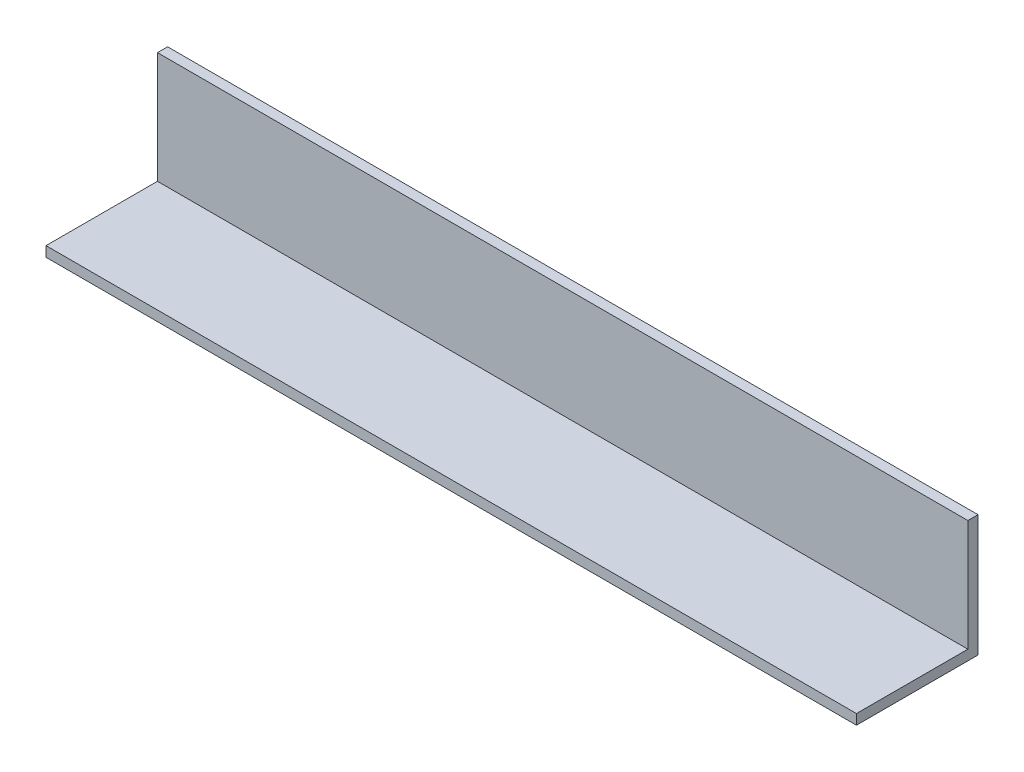
ISO-10303-21;
HEADER;
FILE_DESCRIPTION(('STEP AP214'),'2;1');
FILE_NAME('part.step','',(''),(''),'','','');
FILE_SCHEMA(('AUTOMOTIVE_DESIGN { 1 0 10303 214 1 1 1 1 }'));
ENDSEC;
DATA;
#1=APPLICATION_CONTEXT('core data for automotive mechanical design processes');
#2=APPLICATION_PROTOCOL_DEFINITION('international standard','automotive_design',2000,#1);
#3=PRODUCT_CONTEXT('',#1,'mechanical');
#4=PRODUCT('Part','Part','',(#3));
#5=PRODUCT_RELATED_PRODUCT_CATEGORY('part','',(#4));
#6=PRODUCT_DEFINITION_FORMATION('','',#4);
#7=PRODUCT_DEFINITION_CONTEXT('part definition',#1,'design');
#8=PRODUCT_DEFINITION('design','',#6,#7);
#9=PRODUCT_DEFINITION_SHAPE('','',#8);
#10=(LENGTH_UNIT() NAMED_UNIT(*) SI_UNIT(.MILLI.,.METRE.));
#11=(NAMED_UNIT(*) PLANE_ANGLE_UNIT() SI_UNIT($,.RADIAN.));
#12=(NAMED_UNIT(*) SI_UNIT($,.STERADIAN.) SOLID_ANGLE_UNIT());
#13=UNCERTAINTY_MEASURE_WITH_UNIT(LENGTH_MEASURE(1.E-05),#10,'distance_accuracy_value','');
#14=(GEOMETRIC_REPRESENTATION_CONTEXT(3) GLOBAL_UNCERTAINTY_ASSIGNED_CONTEXT((#13)) GLOBAL_UNIT_ASSIGNED_CONTEXT((#10,
#11,#12)) REPRESENTATION_CONTEXT('',''));
#15=CARTESIAN_POINT('',(0.,0.,0.));
#16=DIRECTION('',(0.,0.,1.));
#17=DIRECTION('',(1.,0.,0.));
#18=AXIS2_PLACEMENT_3D('',#15,#16,#17);
#19=CARTESIAN_POINT('',(127.,0.,0.));
#20=DIRECTION('',(0.,0.,-1.));
#21=DIRECTION('',(-1.,0.,0.));
#22=AXIS2_PLACEMENT_3D('',#19,#20,#21);
#23=PLANE('',#22);
#24=DIRECTION('',(0.,-1.,0.));
#25=VECTOR('',#24,1.);
#26=CARTESIAN_POINT('',(127.,0.,0.));
#27=LINE('',#26,#25);
#28=CARTESIAN_POINT('',(127.,1.5875,0.));
#29=VERTEX_POINT('',#28);
#30=CARTESIAN_POINT('',(127.,0.,0.));
#31=VERTEX_POINT('',#30);
#32=EDGE_CURVE('E78',#29,#31,#27,.T.);
#33=ORIENTED_EDGE('',*,*,#32,.F.);
#34=DIRECTION('',(-1.,0.,0.));
#35=VECTOR('',#34,1.);
#36=CARTESIAN_POINT('',(127.,1.5875,0.));
#37=LINE('',#36,#35);
#38=CARTESIAN_POINT('',(0.,1.5875,0.));
#39=VERTEX_POINT('',#38);
#40=EDGE_CURVE('E120',#29,#39,#37,.T.);
#41=ORIENTED_EDGE('',*,*,#40,.T.);
#42=DIRECTION('',(0.,-1.,0.));
#43=VECTOR('',#42,1.);
#44=CARTESIAN_POINT('',(0.,0.,0.));
#45=LINE('',#44,#43);
#46=CARTESIAN_POINT('',(0.,0.,0.));
#47=VERTEX_POINT('',#46);
#48=EDGE_CURVE('E117',#39,#47,#45,.T.);
#49=ORIENTED_EDGE('',*,*,#48,.T.);
#50=DIRECTION('',(-1.,0.,0.));
#51=VECTOR('',#50,1.);
#52=CARTESIAN_POINT('',(127.,0.,0.));
#53=LINE('',#52,#51);
#54=EDGE_CURVE('E11',#31,#47,#53,.T.);
#55=ORIENTED_EDGE('',*,*,#54,.F.);
#56=EDGE_LOOP('',(#33,#41,#49,#55));
#57=FACE_BOUND('',#56,.T.);
#58=ADVANCED_FACE('F33',(#57),#23,.F.);
#59=CARTESIAN_POINT('',(127.,0.,0.));
#60=DIRECTION('',(0.,1.,0.));
#61=DIRECTION('',(0.,0.,1.));
#62=AXIS2_PLACEMENT_3D('',#59,#60,#61);
#63=PLANE('',#62);
#64=DIRECTION('',(0.,0.,-1.));
#65=VECTOR('',#64,1.);
#66=CARTESIAN_POINT('',(0.,0.,0.));
#67=LINE('',#66,#65);
#68=CARTESIAN_POINT('',(0.,0.,-19.05));
#69=VERTEX_POINT('',#68);
#70=EDGE_CURVE('E119',#47,#69,#67,.T.);
#71=ORIENTED_EDGE('',*,*,#70,.T.);
#72=DIRECTION('',(-1.,0.,0.));
#73=VECTOR('',#72,1.);
#74=CARTESIAN_POINT('',(127.,0.,-19.05));
#75=LINE('',#74,#73);
#76=CARTESIAN_POINT('',(127.,0.,-19.05));
#77=VERTEX_POINT('',#76);
#78=EDGE_CURVE('E40',#77,#69,#75,.T.);
#79=ORIENTED_EDGE('',*,*,#78,.F.);
#80=DIRECTION('',(0.,0.,-1.));
#81=VECTOR('',#80,1.);
#82=CARTESIAN_POINT('',(127.,0.,0.));
#83=LINE('',#82,#81);
#84=EDGE_CURVE('E113',#31,#77,#83,.T.);
#85=ORIENTED_EDGE('',*,*,#84,.F.);
#86=ORIENTED_EDGE('',*,*,#54,.T.);
#87=EDGE_LOOP('',(#71,#79,#85,#86));
#88=FACE_BOUND('',#87,.T.);
#89=ADVANCED_FACE('F140',(#88),#63,.F.);
#90=CARTESIAN_POINT('',(127.,0.,-19.05));
#91=DIRECTION('',(0.,0.,1.));
#92=DIRECTION('',(1.,0.,0.));
#93=AXIS2_PLACEMENT_3D('',#90,#91,#92);
#94=PLANE('',#93);
#95=DIRECTION('',(0.,1.,0.));
#96=VECTOR('',#95,1.);
#97=CARTESIAN_POINT('',(0.,0.,-19.05));
#98=LINE('',#97,#96);
#99=CARTESIAN_POINT('',(0.,19.05,-19.05));
#100=VERTEX_POINT('',#99);
#101=EDGE_CURVE('E73',#69,#100,#98,.T.);
#102=ORIENTED_EDGE('',*,*,#101,.T.);
#103=DIRECTION('',(-1.,0.,0.));
#104=VECTOR('',#103,1.);
#105=CARTESIAN_POINT('',(127.,19.05,-19.05));
#106=LINE('',#105,#104);
#107=CARTESIAN_POINT('',(127.,19.05,-19.05));
#108=VERTEX_POINT('',#107);
#109=EDGE_CURVE('E110',#108,#100,#106,.T.);
#110=ORIENTED_EDGE('',*,*,#109,.F.);
#111=DIRECTION('',(0.,1.,0.));
#112=VECTOR('',#111,1.);
#113=CARTESIAN_POINT('',(127.,0.,-19.05));
#114=LINE('',#113,#112);
#115=EDGE_CURVE('E56',#77,#108,#114,.T.);
#116=ORIENTED_EDGE('',*,*,#115,.F.);
#117=ORIENTED_EDGE('',*,*,#78,.T.);
#118=EDGE_LOOP('',(#102,#110,#116,#117));
#119=FACE_BOUND('',#118,.T.);
#120=ADVANCED_FACE('F124',(#119),#94,.F.);
#121=CARTESIAN_POINT('',(127.,19.05,0.));
#122=DIRECTION('',(0.,-1.,0.));
#123=DIRECTION('',(0.,0.,-1.));
#124=AXIS2_PLACEMENT_3D('',#121,#122,#123);
#125=PLANE('',#124);
#126=DIRECTION('',(0.,0.,1.));
#127=VECTOR('',#126,1.);
#128=CARTESIAN_POINT('',(0.,19.05,0.));
#129=LINE('',#128,#127);
#130=CARTESIAN_POINT('',(0.,19.05,-17.4625));
#131=VERTEX_POINT('',#130);
#132=EDGE_CURVE('E107',#100,#131,#129,.T.);
#133=ORIENTED_EDGE('',*,*,#132,.T.);
#134=DIRECTION('',(-1.,0.,0.));
#135=VECTOR('',#134,1.);
#136=CARTESIAN_POINT('',(127.,19.05,-17.4625));
#137=LINE('',#136,#135);
#138=CARTESIAN_POINT('',(127.,19.05,-17.4625));
#139=VERTEX_POINT('',#138);
#140=EDGE_CURVE('E47',#139,#131,#137,.T.);
#141=ORIENTED_EDGE('',*,*,#140,.F.);
#142=DIRECTION('',(0.,0.,1.));
#143=VECTOR('',#142,1.);
#144=CARTESIAN_POINT('',(127.,19.05,0.));
#145=LINE('',#144,#143);
#146=EDGE_CURVE('E105',#108,#139,#145,.T.);
#147=ORIENTED_EDGE('',*,*,#146,.F.);
#148=ORIENTED_EDGE('',*,*,#109,.T.);
#149=EDGE_LOOP('',(#133,#141,#147,#148));
#150=FACE_BOUND('',#149,.T.);
#151=ADVANCED_FACE('F104',(#150),#125,.F.);
#152=CARTESIAN_POINT('',(127.,0.,0.));
#153=DIRECTION('',(-1.,0.,0.));
#154=DIRECTION('',(0.,0.,1.));
#155=AXIS2_PLACEMENT_3D('',#152,#153,#154);
#156=PLANE('',#155);
#157=DIRECTION('',(0.,-1.,0.));
#158=VECTOR('',#157,1.);
#159=CARTESIAN_POINT('',(127.,19.05,-17.4625));
#160=LINE('',#159,#158);
#161=CARTESIAN_POINT('',(127.,1.5875,-17.4625));
#162=VERTEX_POINT('',#161);
#163=EDGE_CURVE('E94',#139,#162,#160,.T.);
#164=ORIENTED_EDGE('',*,*,#163,.T.);
#165=DIRECTION('',(0.,0.,1.));
#166=VECTOR('',#165,1.);
#167=CARTESIAN_POINT('',(127.,1.5875,0.));
#168=LINE('',#167,#166);
#169=EDGE_CURVE('E98',#162,#29,#168,.T.);
#170=ORIENTED_EDGE('',*,*,#169,.T.);
#171=ORIENTED_EDGE('',*,*,#32,.T.);
#172=ORIENTED_EDGE('',*,*,#84,.T.);
#173=ORIENTED_EDGE('',*,*,#115,.T.);
#174=ORIENTED_EDGE('',*,*,#146,.T.);
#175=EDGE_LOOP('',(#164,#170,#171,#172,#173,#174));
#176=FACE_BOUND('',#175,.T.);
#177=ADVANCED_FACE('F109',(#176),#156,.F.);
#178=CARTESIAN_POINT('',(0.,0.,0.));
#179=DIRECTION('',(-1.,0.,0.));
#180=DIRECTION('',(0.,0.,1.));
#181=AXIS2_PLACEMENT_3D('',#178,#179,#180);
#182=PLANE('',#181);
#183=DIRECTION('',(0.,0.,1.));
#184=VECTOR('',#183,1.);
#185=CARTESIAN_POINT('',(0.,1.5875,0.));
#186=LINE('',#185,#184);
#187=CARTESIAN_POINT('',(0.,1.5875,-17.4625));
#188=VERTEX_POINT('',#187);
#189=EDGE_CURVE('E99',#188,#39,#186,.T.);
#190=ORIENTED_EDGE('',*,*,#189,.F.);
#191=DIRECTION('',(0.,-1.,0.));
#192=VECTOR('',#191,1.);
#193=CARTESIAN_POINT('',(0.,19.05,-17.4625));
#194=LINE('',#193,#192);
#195=EDGE_CURVE('E131',#131,#188,#194,.T.);
#196=ORIENTED_EDGE('',*,*,#195,.F.);
#197=ORIENTED_EDGE('',*,*,#132,.F.);
#198=ORIENTED_EDGE('',*,*,#101,.F.);
#199=ORIENTED_EDGE('',*,*,#70,.F.);
#200=ORIENTED_EDGE('',*,*,#48,.F.);
#201=EDGE_LOOP('',(#190,#196,#197,#198,#199,#200));
#202=FACE_BOUND('',#201,.T.);
#203=ADVANCED_FACE('F129',(#202),#182,.T.);
#204=CARTESIAN_POINT('',(127.,1.5875,0.));
#205=DIRECTION('',(0.,-1.,0.));
#206=DIRECTION('',(0.,0.,-1.));
#207=AXIS2_PLACEMENT_3D('',#204,#205,#206);
#208=PLANE('',#207);
#209=ORIENTED_EDGE('',*,*,#189,.T.);
#210=ORIENTED_EDGE('',*,*,#40,.F.);
#211=ORIENTED_EDGE('',*,*,#169,.F.);
#212=DIRECTION('',(-1.,0.,0.));
#213=VECTOR('',#212,1.);
#214=CARTESIAN_POINT('',(127.,1.5875,-17.4625));
#215=LINE('',#214,#213);
#216=EDGE_CURVE('E96',#162,#188,#215,.T.);
#217=ORIENTED_EDGE('',*,*,#216,.T.);
#218=EDGE_LOOP('',(#209,#210,#211,#217));
#219=FACE_BOUND('',#218,.T.);
#220=ADVANCED_FACE('F143',(#219),#208,.F.);
#221=CARTESIAN_POINT('',(127.,19.05,-17.4625));
#222=DIRECTION('',(0.,0.,-1.));
#223=DIRECTION('',(0.,1.,0.));
#224=AXIS2_PLACEMENT_3D('',#221,#222,#223);
#225=PLANE('',#224);
#226=ORIENTED_EDGE('',*,*,#195,.T.);
#227=ORIENTED_EDGE('',*,*,#216,.F.);
#228=ORIENTED_EDGE('',*,*,#163,.F.);
#229=ORIENTED_EDGE('',*,*,#140,.T.);
#230=EDGE_LOOP('',(#226,#227,#228,#229));
#231=FACE_BOUND('',#230,.T.);
#232=ADVANCED_FACE('F95',(#231),#225,.F.);
#233=CLOSED_SHELL('',(#58,#89,#120,#151,#177,#203,#220,#232));
#234=MANIFOLD_SOLID_BREP('B2',#233);
#235=ADVANCED_BREP_SHAPE_REPRESENTATION('',(#18,#234),#14);
#236=SHAPE_DEFINITION_REPRESENTATION(#9,#235);
ENDSEC;
END-ISO-10303-21;
